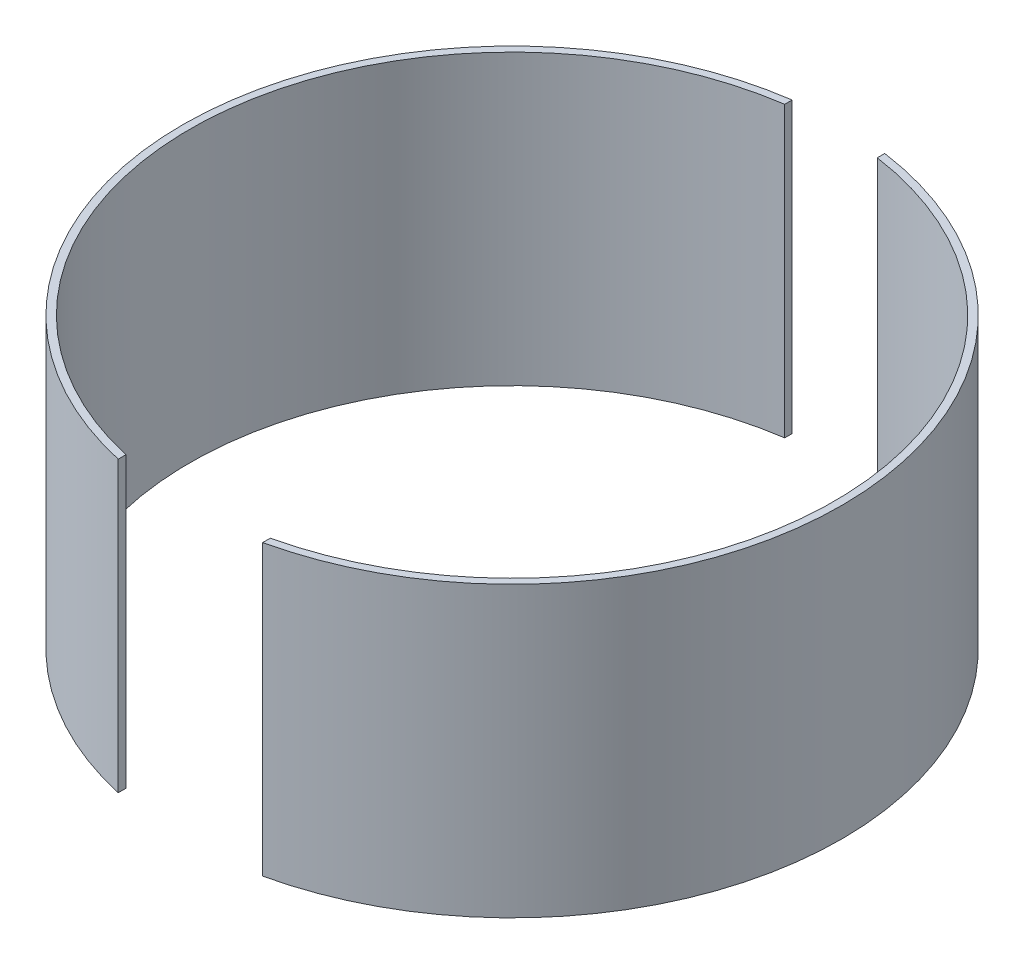
ISO-10303-21;
HEADER;
FILE_DESCRIPTION(('STEP AP214'),'2;1');
FILE_NAME('part.step','',(''),(''),'','','');
FILE_SCHEMA(('AUTOMOTIVE_DESIGN { 1 0 10303 214 1 1 1 1 }'));
ENDSEC;
DATA;
#1=APPLICATION_CONTEXT('core data for automotive mechanical design processes');
#2=APPLICATION_PROTOCOL_DEFINITION('international standard','automotive_design',2000,#1);
#3=PRODUCT_CONTEXT('',#1,'mechanical');
#4=PRODUCT('Part','Part','',(#3));
#5=PRODUCT_RELATED_PRODUCT_CATEGORY('part','',(#4));
#6=PRODUCT_DEFINITION_FORMATION('','',#4);
#7=PRODUCT_DEFINITION_CONTEXT('part definition',#1,'design');
#8=PRODUCT_DEFINITION('design','',#6,#7);
#9=PRODUCT_DEFINITION_SHAPE('','',#8);
#10=(LENGTH_UNIT() NAMED_UNIT(*) SI_UNIT(.MILLI.,.METRE.));
#11=(NAMED_UNIT(*) PLANE_ANGLE_UNIT() SI_UNIT($,.RADIAN.));
#12=(NAMED_UNIT(*) SI_UNIT($,.STERADIAN.) SOLID_ANGLE_UNIT());
#13=UNCERTAINTY_MEASURE_WITH_UNIT(LENGTH_MEASURE(1.E-05),#10,'distance_accuracy_value','');
#14=(GEOMETRIC_REPRESENTATION_CONTEXT(3) GLOBAL_UNCERTAINTY_ASSIGNED_CONTEXT((#13)) GLOBAL_UNIT_ASSIGNED_CONTEXT((#10,
#11,#12)) REPRESENTATION_CONTEXT('',''));
#15=CARTESIAN_POINT('',(0.,0.,0.));
#16=DIRECTION('',(0.,0.,1.));
#17=DIRECTION('',(1.,0.,0.));
#18=AXIS2_PLACEMENT_3D('',#15,#16,#17);
#19=CARTESIAN_POINT('',(0.,78.,0.));
#20=DIRECTION('',(0.,1.,0.));
#21=DIRECTION('',(0.,0.,1.));
#22=AXIS2_PLACEMENT_3D('',#19,#20,#21);
#23=PLANE('',#22);
#24=CARTESIAN_POINT('',(0.,78.,0.));
#25=DIRECTION('',(0.,1.,0.));
#26=DIRECTION('',(0.,0.,1.));
#27=AXIS2_PLACEMENT_3D('',#24,#25,#26);
#28=CIRCLE('',#27,89.);
#29=CARTESIAN_POINT('',(-12.5,78.,-88.1178188563471));
#30=VERTEX_POINT('',#29);
#31=CARTESIAN_POINT('',(-19.5,78.,86.8374919029793));
#32=VERTEX_POINT('',#31);
#33=EDGE_CURVE('E104',#30,#32,#28,.T.);
#34=ORIENTED_EDGE('',*,*,#33,.T.);
#35=DIRECTION('',(0.,0.,-1.));
#36=VECTOR('',#35,1.);
#37=CARTESIAN_POINT('',(-19.5,78.,208.));
#38=LINE('',#37,#36);
#39=CARTESIAN_POINT('',(-19.5,78.,84.7864965663755));
#40=VERTEX_POINT('',#39);
#41=EDGE_CURVE('E58',#32,#40,#38,.T.);
#42=ORIENTED_EDGE('',*,*,#41,.T.);
#43=CARTESIAN_POINT('',(0.,78.,0.));
#44=DIRECTION('',(0.,1.,0.));
#45=DIRECTION('',(0.,0.,1.));
#46=AXIS2_PLACEMENT_3D('',#43,#44,#45);
#47=CIRCLE('',#46,87.);
#48=CARTESIAN_POINT('',(-12.5,78.,-86.0973286461316));
#49=VERTEX_POINT('',#48);
#50=EDGE_CURVE('E96',#49,#40,#47,.T.);
#51=ORIENTED_EDGE('',*,*,#50,.F.);
#52=DIRECTION('',(0.,0.,1.));
#53=VECTOR('',#52,1.);
#54=CARTESIAN_POINT('',(-12.5,78.,-100.));
#55=LINE('',#54,#53);
#56=EDGE_CURVE('E80',#30,#49,#55,.T.);
#57=ORIENTED_EDGE('',*,*,#56,.F.);
#58=EDGE_LOOP('',(#34,#42,#51,#57));
#59=FACE_BOUND('',#58,.T.);
#60=ADVANCED_FACE('F42',(#59),#23,.T.);
#61=CARTESIAN_POINT('',(0.,0.,0.));
#62=DIRECTION('',(0.,1.,0.));
#63=DIRECTION('',(0.,0.,1.));
#64=AXIS2_PLACEMENT_3D('',#61,#62,#63);
#65=PLANE('',#64);
#66=DIRECTION('',(0.,0.,-1.));
#67=VECTOR('',#66,1.);
#68=CARTESIAN_POINT('',(-19.5,0.,208.));
#69=LINE('',#68,#67);
#70=CARTESIAN_POINT('',(-19.5,0.,86.8374919029793));
#71=VERTEX_POINT('',#70);
#72=CARTESIAN_POINT('',(-19.5,0.,84.7864965663755));
#73=VERTEX_POINT('',#72);
#74=EDGE_CURVE('E12',#71,#73,#69,.T.);
#75=ORIENTED_EDGE('',*,*,#74,.F.);
#76=CARTESIAN_POINT('',(0.,0.,0.));
#77=DIRECTION('',(0.,1.,0.));
#78=DIRECTION('',(0.,0.,1.));
#79=AXIS2_PLACEMENT_3D('',#76,#77,#78);
#80=CIRCLE('',#79,89.);
#81=CARTESIAN_POINT('',(-12.5,0.,-88.1178188563471));
#82=VERTEX_POINT('',#81);
#83=EDGE_CURVE('E99',#82,#71,#80,.T.);
#84=ORIENTED_EDGE('',*,*,#83,.F.);
#85=DIRECTION('',(0.,0.,1.));
#86=VECTOR('',#85,1.);
#87=CARTESIAN_POINT('',(-12.5,0.,-100.));
#88=LINE('',#87,#86);
#89=CARTESIAN_POINT('',(-12.5,0.,-86.0973286461316));
#90=VERTEX_POINT('',#89);
#91=EDGE_CURVE('E106',#82,#90,#88,.T.);
#92=ORIENTED_EDGE('',*,*,#91,.T.);
#93=CARTESIAN_POINT('',(0.,0.,0.));
#94=DIRECTION('',(0.,1.,0.));
#95=DIRECTION('',(0.,0.,1.));
#96=AXIS2_PLACEMENT_3D('',#93,#94,#95);
#97=CIRCLE('',#96,87.);
#98=EDGE_CURVE('E45',#90,#73,#97,.T.);
#99=ORIENTED_EDGE('',*,*,#98,.T.);
#100=EDGE_LOOP('',(#75,#84,#92,#99));
#101=FACE_BOUND('',#100,.T.);
#102=ADVANCED_FACE('F113',(#101),#65,.F.);
#103=CARTESIAN_POINT('',(0.,78.,0.));
#104=DIRECTION('',(0.,-1.,0.));
#105=DIRECTION('',(0.,0.,-1.));
#106=AXIS2_PLACEMENT_3D('',#103,#104,#105);
#107=CYLINDRICAL_SURFACE('',#106,89.);
#108=DIRECTION('',(0.,-1.,0.));
#109=VECTOR('',#108,1.);
#110=CARTESIAN_POINT('',(-19.5,78.,86.8374919029793));
#111=LINE('',#110,#109);
#112=EDGE_CURVE('E50',#32,#71,#111,.T.);
#113=ORIENTED_EDGE('',*,*,#112,.F.);
#114=ORIENTED_EDGE('',*,*,#33,.F.);
#115=DIRECTION('',(0.,-1.,0.));
#116=VECTOR('',#115,1.);
#117=CARTESIAN_POINT('',(-12.5,78.,-88.1178188563471));
#118=LINE('',#117,#116);
#119=EDGE_CURVE('E86',#82,#30,#118,.F.);
#120=ORIENTED_EDGE('',*,*,#119,.F.);
#121=ORIENTED_EDGE('',*,*,#83,.T.);
#122=EDGE_LOOP('',(#113,#114,#120,#121));
#123=FACE_BOUND('',#122,.T.);
#124=ADVANCED_FACE('F115',(#123),#107,.T.);
#125=CARTESIAN_POINT('',(0.,78.,0.));
#126=DIRECTION('',(0.,-1.,0.));
#127=DIRECTION('',(0.,0.,-1.));
#128=AXIS2_PLACEMENT_3D('',#125,#126,#127);
#129=CYLINDRICAL_SURFACE('',#128,87.);
#130=ORIENTED_EDGE('',*,*,#50,.T.);
#131=DIRECTION('',(0.,-1.,0.));
#132=VECTOR('',#131,1.);
#133=CARTESIAN_POINT('',(-19.5,78.,84.7864965663755));
#134=LINE('',#133,#132);
#135=EDGE_CURVE('E62',#40,#73,#134,.T.);
#136=ORIENTED_EDGE('',*,*,#135,.T.);
#137=ORIENTED_EDGE('',*,*,#98,.F.);
#138=DIRECTION('',(0.,-1.,0.));
#139=VECTOR('',#138,1.);
#140=CARTESIAN_POINT('',(-12.5,78.,-86.0973286461316));
#141=LINE('',#140,#139);
#142=EDGE_CURVE('E83',#90,#49,#141,.F.);
#143=ORIENTED_EDGE('',*,*,#142,.T.);
#144=EDGE_LOOP('',(#130,#136,#137,#143));
#145=FACE_BOUND('',#144,.T.);
#146=ADVANCED_FACE('F95',(#145),#129,.F.);
#147=CARTESIAN_POINT('',(-12.5,0.,-100.));
#148=DIRECTION('',(1.,0.,0.));
#149=DIRECTION('',(0.,0.,-1.));
#150=AXIS2_PLACEMENT_3D('',#147,#148,#149);
#151=PLANE('',#150);
#152=ORIENTED_EDGE('',*,*,#119,.T.);
#153=ORIENTED_EDGE('',*,*,#56,.T.);
#154=ORIENTED_EDGE('',*,*,#142,.F.);
#155=ORIENTED_EDGE('',*,*,#91,.F.);
#156=EDGE_LOOP('',(#152,#153,#154,#155));
#157=FACE_BOUND('',#156,.T.);
#158=ADVANCED_FACE('F82',(#157),#151,.T.);
#159=CARTESIAN_POINT('',(-19.5,0.,208.));
#160=DIRECTION('',(1.,0.,0.));
#161=DIRECTION('',(0.,0.,-1.));
#162=AXIS2_PLACEMENT_3D('',#159,#160,#161);
#163=PLANE('',#162);
#164=ORIENTED_EDGE('',*,*,#112,.T.);
#165=ORIENTED_EDGE('',*,*,#74,.T.);
#166=ORIENTED_EDGE('',*,*,#135,.F.);
#167=ORIENTED_EDGE('',*,*,#41,.F.);
#168=EDGE_LOOP('',(#164,#165,#166,#167));
#169=FACE_BOUND('',#168,.T.);
#170=ADVANCED_FACE('F116',(#169),#163,.T.);
#171=CLOSED_SHELL('',(#60,#102,#124,#146,#158,#170));
#172=MANIFOLD_SOLID_BREP('B2',#171);
#173=CARTESIAN_POINT('',(12.5,0.,-100.));
#174=DIRECTION('',(1.,0.,0.));
#175=DIRECTION('',(0.,0.,-1.));
#176=AXIS2_PLACEMENT_3D('',#173,#174,#175);
#177=PLANE('',#176);
#178=DIRECTION('',(0.,0.,1.));
#179=VECTOR('',#178,1.);
#180=CARTESIAN_POINT('',(12.5,0.,-100.));
#181=LINE('',#180,#179);
#182=CARTESIAN_POINT('',(12.5,0.,-88.1178188563471));
#183=VERTEX_POINT('',#182);
#184=CARTESIAN_POINT('',(12.5,0.,-86.0973286461316));
#185=VERTEX_POINT('',#184);
#186=EDGE_CURVE('E211',#183,#185,#181,.T.);
#187=ORIENTED_EDGE('',*,*,#186,.T.);
#188=DIRECTION('',(0.,-1.,0.));
#189=VECTOR('',#188,1.);
#190=CARTESIAN_POINT('',(12.5,78.,-86.0973286461316));
#191=LINE('',#190,#189);
#192=CARTESIAN_POINT('',(12.5,78.,-86.0973286461316));
#193=VERTEX_POINT('',#192);
#194=EDGE_CURVE('E173',#185,#193,#191,.F.);
#195=ORIENTED_EDGE('',*,*,#194,.T.);
#196=DIRECTION('',(0.,0.,1.));
#197=VECTOR('',#196,1.);
#198=CARTESIAN_POINT('',(12.5,78.,-100.));
#199=LINE('',#198,#197);
#200=CARTESIAN_POINT('',(12.5,78.,-88.1178188563471));
#201=VERTEX_POINT('',#200);
#202=EDGE_CURVE('E232',#201,#193,#199,.T.);
#203=ORIENTED_EDGE('',*,*,#202,.F.);
#204=DIRECTION('',(0.,-1.,0.));
#205=VECTOR('',#204,1.);
#206=CARTESIAN_POINT('',(12.5,78.,-88.1178188563471));
#207=LINE('',#206,#205);
#208=EDGE_CURVE('E223',#183,#201,#207,.F.);
#209=ORIENTED_EDGE('',*,*,#208,.F.);
#210=EDGE_LOOP('',(#187,#195,#203,#209));
#211=FACE_BOUND('',#210,.T.);
#212=ADVANCED_FACE('F165',(#211),#177,.F.);
#213=CARTESIAN_POINT('',(0.,78.,0.));
#214=DIRECTION('',(0.,-1.,0.));
#215=DIRECTION('',(0.,0.,-1.));
#216=AXIS2_PLACEMENT_3D('',#213,#214,#215);
#217=CYLINDRICAL_SURFACE('',#216,89.);
#218=DIRECTION('',(0.,-1.,0.));
#219=VECTOR('',#218,1.);
#220=CARTESIAN_POINT('',(19.5,78.,86.8374919029793));
#221=LINE('',#220,#219);
#222=CARTESIAN_POINT('',(19.5,0.,86.8374919029793));
#223=VERTEX_POINT('',#222);
#224=CARTESIAN_POINT('',(19.5,78.,86.8374919029793));
#225=VERTEX_POINT('',#224);
#226=EDGE_CURVE('E205',#223,#225,#221,.F.);
#227=ORIENTED_EDGE('',*,*,#226,.F.);
#228=CARTESIAN_POINT('',(0.,0.,0.));
#229=DIRECTION('',(0.,1.,0.));
#230=DIRECTION('',(0.,0.,1.));
#231=AXIS2_PLACEMENT_3D('',#228,#229,#230);
#232=CIRCLE('',#231,89.);
#233=EDGE_CURVE('E224',#223,#183,#232,.T.);
#234=ORIENTED_EDGE('',*,*,#233,.T.);
#235=ORIENTED_EDGE('',*,*,#208,.T.);
#236=CARTESIAN_POINT('',(0.,78.,0.));
#237=DIRECTION('',(0.,1.,0.));
#238=DIRECTION('',(0.,0.,1.));
#239=AXIS2_PLACEMENT_3D('',#236,#237,#238);
#240=CIRCLE('',#239,89.);
#241=EDGE_CURVE('E217',#225,#201,#240,.T.);
#242=ORIENTED_EDGE('',*,*,#241,.F.);
#243=EDGE_LOOP('',(#227,#234,#235,#242));
#244=FACE_BOUND('',#243,.T.);
#245=ADVANCED_FACE('F167',(#244),#217,.T.);
#246=CARTESIAN_POINT('',(0.,78.,0.));
#247=DIRECTION('',(0.,-1.,0.));
#248=DIRECTION('',(0.,0.,-1.));
#249=AXIS2_PLACEMENT_3D('',#246,#247,#248);
#250=CYLINDRICAL_SURFACE('',#249,87.);
#251=CARTESIAN_POINT('',(0.,0.,0.));
#252=DIRECTION('',(0.,1.,0.));
#253=DIRECTION('',(0.,0.,1.));
#254=AXIS2_PLACEMENT_3D('',#251,#252,#253);
#255=CIRCLE('',#254,87.);
#256=CARTESIAN_POINT('',(19.5,0.,84.7864965663755));
#257=VERTEX_POINT('',#256);
#258=EDGE_CURVE('E187',#257,#185,#255,.T.);
#259=ORIENTED_EDGE('',*,*,#258,.F.);
#260=DIRECTION('',(0.,-1.,0.));
#261=VECTOR('',#260,1.);
#262=CARTESIAN_POINT('',(19.5,78.,84.7864965663755));
#263=LINE('',#262,#261);
#264=CARTESIAN_POINT('',(19.5,78.,84.7864965663755));
#265=VERTEX_POINT('',#264);
#266=EDGE_CURVE('E40',#257,#265,#263,.F.);
#267=ORIENTED_EDGE('',*,*,#266,.T.);
#268=CARTESIAN_POINT('',(0.,78.,0.));
#269=DIRECTION('',(0.,1.,0.));
#270=DIRECTION('',(0.,0.,1.));
#271=AXIS2_PLACEMENT_3D('',#268,#269,#270);
#272=CIRCLE('',#271,87.);
#273=EDGE_CURVE('E219',#265,#193,#272,.T.);
#274=ORIENTED_EDGE('',*,*,#273,.T.);
#275=ORIENTED_EDGE('',*,*,#194,.F.);
#276=EDGE_LOOP('',(#259,#267,#274,#275));
#277=FACE_BOUND('',#276,.T.);
#278=ADVANCED_FACE('F238',(#277),#250,.F.);
#279=CARTESIAN_POINT('',(0.,0.,0.));
#280=DIRECTION('',(0.,1.,0.));
#281=DIRECTION('',(0.,0.,1.));
#282=AXIS2_PLACEMENT_3D('',#279,#280,#281);
#283=PLANE('',#282);
#284=DIRECTION('',(0.,0.,-1.));
#285=VECTOR('',#284,1.);
#286=CARTESIAN_POINT('',(19.5,0.,208.));
#287=LINE('',#286,#285);
#288=EDGE_CURVE('E207',#223,#257,#287,.T.);
#289=ORIENTED_EDGE('',*,*,#288,.T.);
#290=ORIENTED_EDGE('',*,*,#258,.T.);
#291=ORIENTED_EDGE('',*,*,#186,.F.);
#292=ORIENTED_EDGE('',*,*,#233,.F.);
#293=EDGE_LOOP('',(#289,#290,#291,#292));
#294=FACE_BOUND('',#293,.T.);
#295=ADVANCED_FACE('F235',(#294),#283,.F.);
#296=CARTESIAN_POINT('',(0.,78.,0.));
#297=DIRECTION('',(0.,1.,0.));
#298=DIRECTION('',(0.,0.,1.));
#299=AXIS2_PLACEMENT_3D('',#296,#297,#298);
#300=PLANE('',#299);
#301=ORIENTED_EDGE('',*,*,#273,.F.);
#302=DIRECTION('',(0.,0.,-1.));
#303=VECTOR('',#302,1.);
#304=CARTESIAN_POINT('',(19.5,78.,208.));
#305=LINE('',#304,#303);
#306=EDGE_CURVE('E180',#225,#265,#305,.T.);
#307=ORIENTED_EDGE('',*,*,#306,.F.);
#308=ORIENTED_EDGE('',*,*,#241,.T.);
#309=ORIENTED_EDGE('',*,*,#202,.T.);
#310=EDGE_LOOP('',(#301,#307,#308,#309));
#311=FACE_BOUND('',#310,.T.);
#312=ADVANCED_FACE('F215',(#311),#300,.T.);
#313=CARTESIAN_POINT('',(19.5,0.,208.));
#314=DIRECTION('',(-1.,0.,0.));
#315=DIRECTION('',(0.,0.,1.));
#316=AXIS2_PLACEMENT_3D('',#313,#314,#315);
#317=PLANE('',#316);
#318=ORIENTED_EDGE('',*,*,#226,.T.);
#319=ORIENTED_EDGE('',*,*,#306,.T.);
#320=ORIENTED_EDGE('',*,*,#266,.F.);
#321=ORIENTED_EDGE('',*,*,#288,.F.);
#322=EDGE_LOOP('',(#318,#319,#320,#321));
#323=FACE_BOUND('',#322,.T.);
#324=ADVANCED_FACE('F206',(#323),#317,.T.);
#325=CLOSED_SHELL('',(#212,#245,#278,#295,#312,#324));
#326=MANIFOLD_SOLID_BREP('B6',#325);
#327=ADVANCED_BREP_SHAPE_REPRESENTATION('',(#18,#172,#326),#14);
#328=SHAPE_DEFINITION_REPRESENTATION(#9,#327);
ENDSEC;
END-ISO-10303-21;
